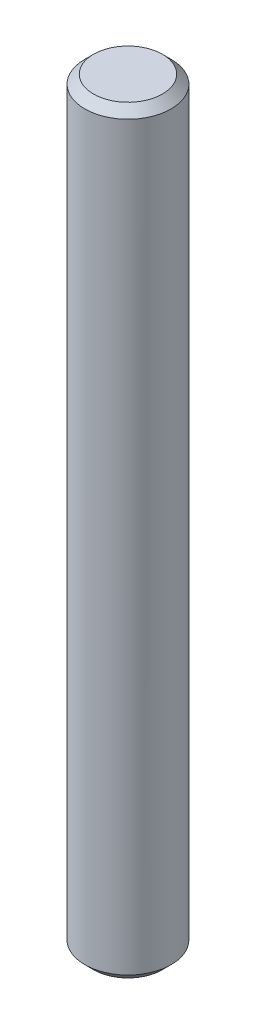
ISO-10303-21;
HEADER;
FILE_DESCRIPTION(('STEP AP214'),'2;1');
FILE_NAME('part.step','',(''),(''),'','','');
FILE_SCHEMA(('AUTOMOTIVE_DESIGN { 1 0 10303 214 1 1 1 1 }'));
ENDSEC;
DATA;
#1=APPLICATION_CONTEXT('core data for automotive mechanical design processes');
#2=APPLICATION_PROTOCOL_DEFINITION('international standard','automotive_design',2000,#1);
#3=PRODUCT_CONTEXT('',#1,'mechanical');
#4=PRODUCT('Part','Part','',(#3));
#5=PRODUCT_RELATED_PRODUCT_CATEGORY('part','',(#4));
#6=PRODUCT_DEFINITION_FORMATION('','',#4);
#7=PRODUCT_DEFINITION_CONTEXT('part definition',#1,'design');
#8=PRODUCT_DEFINITION('design','',#6,#7);
#9=PRODUCT_DEFINITION_SHAPE('','',#8);
#10=(LENGTH_UNIT() NAMED_UNIT(*) SI_UNIT(.MILLI.,.METRE.));
#11=(NAMED_UNIT(*) PLANE_ANGLE_UNIT() SI_UNIT($,.RADIAN.));
#12=(NAMED_UNIT(*) SI_UNIT($,.STERADIAN.) SOLID_ANGLE_UNIT());
#13=UNCERTAINTY_MEASURE_WITH_UNIT(LENGTH_MEASURE(1.E-05),#10,'distance_accuracy_value','');
#14=(GEOMETRIC_REPRESENTATION_CONTEXT(3) GLOBAL_UNCERTAINTY_ASSIGNED_CONTEXT((#13)) GLOBAL_UNIT_ASSIGNED_CONTEXT((#10,
#11,#12)) REPRESENTATION_CONTEXT('',''));
#15=CARTESIAN_POINT('',(0.,0.,0.));
#16=DIRECTION('',(0.,0.,1.));
#17=DIRECTION('',(1.,0.,0.));
#18=AXIS2_PLACEMENT_3D('',#15,#16,#17);
#19=CARTESIAN_POINT('',(0.,44.,0.));
#20=DIRECTION('',(0.,-1.,0.));
#21=DIRECTION('',(1.,0.,0.));
#22=AXIS2_PLACEMENT_3D('',#19,#20,#21);
#23=PLANE('',#22);
#24=CARTESIAN_POINT('',(0.,44.,0.));
#25=DIRECTION('',(0.,-1.,0.));
#26=DIRECTION('',(1.,0.,0.));
#27=AXIS2_PLACEMENT_3D('',#24,#25,#26);
#28=CIRCLE('',#27,4.00000000000002);
#29=CARTESIAN_POINT('',(4.00000000000002,44.,0.));
#30=VERTEX_POINT('',#29);
#31=EDGE_CURVE('E10',#30,#30,#28,.F.);
#32=ORIENTED_EDGE('',*,*,#31,.T.);
#33=EDGE_LOOP('',(#32));
#34=FACE_BOUND('',#33,.T.);
#35=ADVANCED_FACE('F35',(#34),#23,.F.);
#36=CARTESIAN_POINT('',(0.,44.,0.));
#37=DIRECTION('',(0.,1.,0.));
#38=DIRECTION('',(-1.,0.,0.));
#39=AXIS2_PLACEMENT_3D('',#36,#37,#38);
#40=CYLINDRICAL_SURFACE('',#39,5.);
#41=CARTESIAN_POINT('',(0.,-43.,0.));
#42=DIRECTION('',(0.,1.,0.));
#43=DIRECTION('',(-1.,0.,0.));
#44=AXIS2_PLACEMENT_3D('',#41,#42,#43);
#45=CIRCLE('',#44,5.);
#46=CARTESIAN_POINT('',(-4.99999999999998,-43.,0.));
#47=VERTEX_POINT('',#46);
#48=EDGE_CURVE('E47',#47,#47,#45,.T.);
#49=ORIENTED_EDGE('',*,*,#48,.T.);
#50=EDGE_LOOP('',(#49));
#51=FACE_BOUND('',#50,.T.);
#52=CARTESIAN_POINT('',(0.,43.,0.));
#53=DIRECTION('',(0.,-1.,0.));
#54=DIRECTION('',(1.,0.,0.));
#55=AXIS2_PLACEMENT_3D('',#52,#53,#54);
#56=CIRCLE('',#55,5.);
#57=CARTESIAN_POINT('',(5.,43.,0.));
#58=VERTEX_POINT('',#57);
#59=EDGE_CURVE('E51',#58,#58,#56,.T.);
#60=ORIENTED_EDGE('',*,*,#59,.T.);
#61=EDGE_LOOP('',(#60));
#62=FACE_BOUND('',#61,.T.);
#63=ADVANCED_FACE('F57',(#51,#62),#40,.T.);
#64=CARTESIAN_POINT('',(5.,-44.,0.));
#65=DIRECTION('',(0.,1.,0.));
#66=DIRECTION('',(-1.,0.,0.));
#67=AXIS2_PLACEMENT_3D('',#64,#65,#66);
#68=PLANE('',#67);
#69=CARTESIAN_POINT('',(0.,-44.,0.));
#70=DIRECTION('',(0.,1.,0.));
#71=DIRECTION('',(-1.,0.,0.));
#72=AXIS2_PLACEMENT_3D('',#69,#70,#71);
#73=CIRCLE('',#72,3.99999999999997);
#74=CARTESIAN_POINT('',(-3.99999999999995,-44.,0.));
#75=VERTEX_POINT('',#74);
#76=EDGE_CURVE('E43',#75,#75,#73,.F.);
#77=ORIENTED_EDGE('',*,*,#76,.T.);
#78=EDGE_LOOP('',(#77));
#79=FACE_BOUND('',#78,.T.);
#80=ADVANCED_FACE('F65',(#79),#68,.F.);
#81=CARTESIAN_POINT('',(0.,-43.,0.));
#82=DIRECTION('',(0.,1.,0.));
#83=DIRECTION('',(-1.,0.,0.));
#84=AXIS2_PLACEMENT_3D('',#81,#82,#83);
#85=CONICAL_SURFACE('',#84,5.,0.785398163397455);
#86=ORIENTED_EDGE('',*,*,#76,.F.);
#87=EDGE_LOOP('',(#86));
#88=FACE_BOUND('',#87,.T.);
#89=ORIENTED_EDGE('',*,*,#48,.F.);
#90=EDGE_LOOP('',(#89));
#91=FACE_BOUND('',#90,.T.);
#92=ADVANCED_FACE('F61',(#88,#91),#85,.T.);
#93=CARTESIAN_POINT('',(0.,44.,0.));
#94=DIRECTION('',(0.,-1.,0.));
#95=DIRECTION('',(1.,0.,0.));
#96=AXIS2_PLACEMENT_3D('',#93,#94,#95);
#97=CONICAL_SURFACE('',#96,4.00000000000002,0.785398163397451);
#98=ORIENTED_EDGE('',*,*,#59,.F.);
#99=EDGE_LOOP('',(#98));
#100=FACE_BOUND('',#99,.T.);
#101=ORIENTED_EDGE('',*,*,#31,.F.);
#102=EDGE_LOOP('',(#101));
#103=FACE_BOUND('',#102,.T.);
#104=ADVANCED_FACE('F38',(#100,#103),#97,.T.);
#105=CLOSED_SHELL('',(#35,#63,#80,#92,#104));
#106=MANIFOLD_SOLID_BREP('B2',#105);
#107=ADVANCED_BREP_SHAPE_REPRESENTATION('',(#18,#106),#14);
#108=SHAPE_DEFINITION_REPRESENTATION(#9,#107);
ENDSEC;
END-ISO-10303-21;
